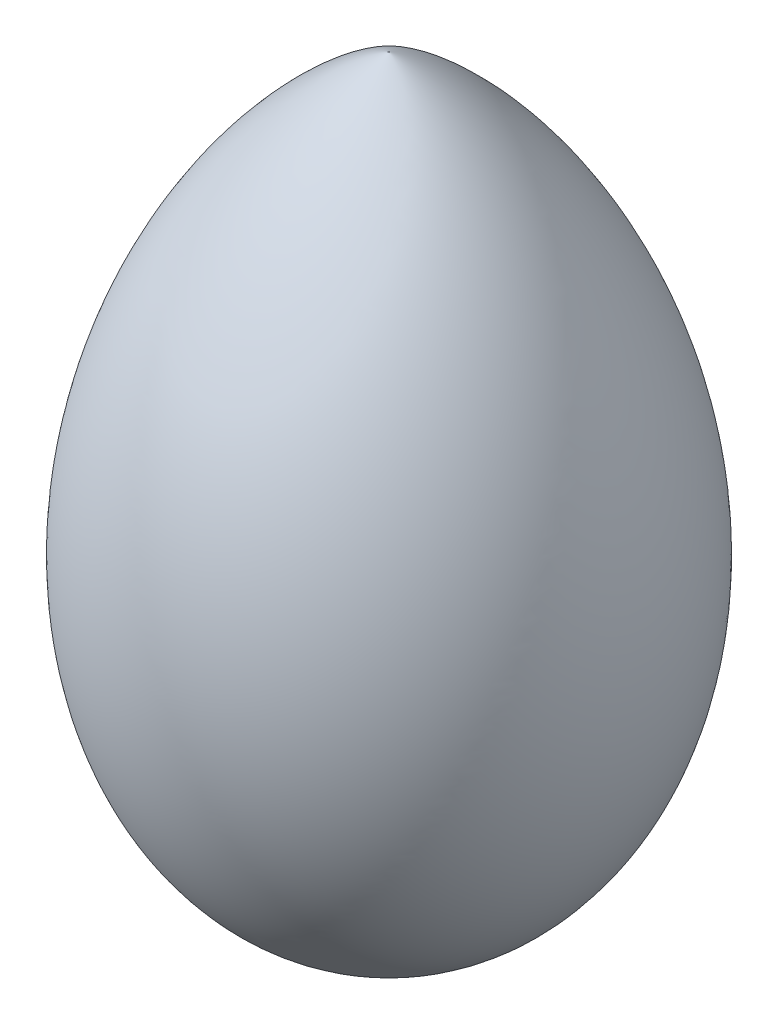
ISO-10303-21;
HEADER;
FILE_DESCRIPTION(('STEP AP214'),'2;1');
FILE_NAME('part.step','',(''),(''),'','','');
FILE_SCHEMA(('AUTOMOTIVE_DESIGN { 1 0 10303 214 1 1 1 1 }'));
ENDSEC;
DATA;
#1=APPLICATION_CONTEXT('core data for automotive mechanical design processes');
#2=APPLICATION_PROTOCOL_DEFINITION('international standard','automotive_design',2000,#1);
#3=PRODUCT_CONTEXT('',#1,'mechanical');
#4=PRODUCT('Part','Part','',(#3));
#5=PRODUCT_RELATED_PRODUCT_CATEGORY('part','',(#4));
#6=PRODUCT_DEFINITION_FORMATION('','',#4);
#7=PRODUCT_DEFINITION_CONTEXT('part definition',#1,'design');
#8=PRODUCT_DEFINITION('design','',#6,#7);
#9=PRODUCT_DEFINITION_SHAPE('','',#8);
#10=(LENGTH_UNIT() NAMED_UNIT(*) SI_UNIT(.MILLI.,.METRE.));
#11=(NAMED_UNIT(*) PLANE_ANGLE_UNIT() SI_UNIT($,.RADIAN.));
#12=(NAMED_UNIT(*) SI_UNIT($,.STERADIAN.) SOLID_ANGLE_UNIT());
#13=UNCERTAINTY_MEASURE_WITH_UNIT(LENGTH_MEASURE(1.E-05),#10,'distance_accuracy_value','');
#14=(GEOMETRIC_REPRESENTATION_CONTEXT(3) GLOBAL_UNCERTAINTY_ASSIGNED_CONTEXT((#13)) GLOBAL_UNIT_ASSIGNED_CONTEXT((#10,
#11,#12)) REPRESENTATION_CONTEXT('',''));
#15=CARTESIAN_POINT('',(0.,0.,0.));
#16=DIRECTION('',(0.,0.,1.));
#17=DIRECTION('',(1.,0.,0.));
#18=AXIS2_PLACEMENT_3D('',#15,#16,#17);
#19=CARTESIAN_POINT('',(-1.0398853970985E-11,-79.5774715459477,0.));
#20=CARTESIAN_POINT('',(0.0876805923341404,-79.5774715459478,0.));
#21=CARTESIAN_POINT('',(0.263797972575064,-79.5762299115467,0.));
#22=CARTESIAN_POINT('',(0.598650590856886,-79.5706425508887,0.));
#23=CARTESIAN_POINT('',(0.950876652571486,-79.5557486563722,0.));
#24=CARTESIAN_POINT('',(1.35262547212403,-79.5334221241474,0.));
#25=CARTESIAN_POINT('',(1.72703176838669,-79.5036800391544,0.));
#26=CARTESIAN_POINT('',(2.11530944355549,-79.4665451551406,0.));
#27=CARTESIAN_POINT('',(2.49518978074726,-79.4220456154996,0.));
#28=CARTESIAN_POINT('',(2.97332683239408,-79.357257557479,0.));
#29=CARTESIAN_POINT('',(3.54269888813024,-79.264927606383,0.));
#30=CARTESIAN_POINT('',(4.20460476573237,-79.1361341339061,0.));
#31=CARTESIAN_POINT('',(4.95420601058507,-78.9604694530783,0.));
#32=CARTESIAN_POINT('',(5.88274142070473,-78.7059305412052,0.));
#33=CARTESIAN_POINT('',(6.98062102196149,-78.3456897199416,0.));
#34=CARTESIAN_POINT('',(8.05511024966161,-77.9193233853256,0.));
#35=CARTESIAN_POINT('',(9.10205208383472,-77.4304669791197,0.));
#36=CARTESIAN_POINT('',(9.95460225664503,-76.9834055975815,0.));
#37=CARTESIAN_POINT('',(10.6240501917869,-76.6027582295668,0.));
#38=CARTESIAN_POINT('',(11.4444934505436,-76.0992379641618,0.));
#39=CARTESIAN_POINT('',(12.4018408014167,-75.4523461029347,0.));
#40=CARTESIAN_POINT('',(13.477279244194,-74.6390919759678,0.));
#41=CARTESIAN_POINT('',(14.6469295160346,-73.6360306984476,0.));
#42=CARTESIAN_POINT('',(16.0324846638131,-72.2982632564667,0.));
#43=CARTESIAN_POINT('',(17.5703966008741,-70.5710496856625,0.));
#44=CARTESIAN_POINT('',(19.0328275386001,-68.6021378476665,0.));
#45=CARTESIAN_POINT('',(20.3892255649037,-66.3962176969675,0.));
#46=CARTESIAN_POINT('',(21.5824370302139,-64.0991845678398,0.));
#47=CARTESIAN_POINT('',(22.4618657728492,-62.078453783561,0.));
#48=CARTESIAN_POINT('',(23.1713994969415,-60.1395719774442,0.));
#49=CARTESIAN_POINT('',(24.0780617054906,-57.195387525395,0.));
#50=CARTESIAN_POINT('',(24.931218987006,-53.4348933087704,0.));
#51=CARTESIAN_POINT('',(25.5220972050229,-48.4503546408996,0.));
#52=CARTESIAN_POINT('',(25.4671494748604,-42.275747962825,0.));
#53=CARTESIAN_POINT('',(24.6891735038918,-36.1519800546308,0.));
#54=CARTESIAN_POINT('',(23.237769759558,-30.1532766900786,0.));
#55=CARTESIAN_POINT('',(21.1535663445063,-24.3446370051788,0.));
#56=CARTESIAN_POINT('',(18.468657066632,-18.7882038275258,0.));
#57=CARTESIAN_POINT('',(15.2067873874591,-13.5488188649898,0.));
#58=CARTESIAN_POINT('',(11.8635522330858,-9.31351533749863,0.));
#59=CARTESIAN_POINT('',(8.65194495273465,-5.99775760871078,0.));
#60=CARTESIAN_POINT('',(6.02821040277064,-3.74744605475118,0.));
#61=CARTESIAN_POINT('',(4.18687293272993,-2.36896894898637,0.));
#62=CARTESIAN_POINT('',(2.79098993640259,-1.4557689738408,0.));
#63=CARTESIAN_POINT('',(1.89911185390225,-0.927774967500933,0.));
#64=CARTESIAN_POINT('',(1.20891495810726,-0.555188094697185,0.));
#65=CARTESIAN_POINT('',(0.792765610770951,-0.345754338027514,0.));
#66=CARTESIAN_POINT('',(0.430888145668768,-0.176914065924159,0.));
#67=CARTESIAN_POINT('',(0.186212553313267,-0.0719592793469132,0.));
#68=CARTESIAN_POINT('',(0.0623290833588892,-0.023341488057453,0.));
#69=CARTESIAN_POINT('',(-6.9406626701159E-12,0.,0.));
#70=B_SPLINE_CURVE_WITH_KNOTS('',4,(#19,#20,#21,#22,#23,#24,#25,#26,#27,#28,#29,#30,#31,#32,#33,
#34,#35,#36,#37,#38,#39,#40,#41,#42,#43,#44,#45,#46,#47,#48,#49,#50,#51,#52,#53,#54,#55,#56,#57,
#58,#59,#60,#61,#62,#63,#64,#65,#66,#67,#68,#69),.UNSPECIFIED.,.F.,.F.,(5,1,1,1,1,1,1,1,1,1,1,1,
1,1,1,1,1,1,1,1,1,1,1,1,1,1,1,1,1,1,1,1,1,1,1,1,1,1,1,1,1,1,1,1,1,1,1,5),(0.0889842727979694,
0.0924312928800519,0.0958783129621343,0.0993253330442168,0.102772353126299,0.106219373208382,
0.109666393290464,0.113113413372547,0.116560433454629,0.123454483320074,0.130348533185519,
0.137242583050964,0.144136632916409,0.157924696562186,0.171712760207964,0.178606822642936,
0.185500885077909,0.192394947512881,0.199289009947854,0.213077084610209,0.226865159272564,
0.240653288577068,0.254441417881571,0.282017661504337,0.309593764096882,0.32834201604834,
0.347090267999798,0.374666472698493,0.388454575047841,0.402242677397188,0.457395073933465,
0.512547464731353,0.567699899774951,0.622852335697732,0.678004748424371,0.733157135249234,
0.788309674961777,0.84346197685155,0.898614443046644,0.925986448179912,0.953358453313181,
0.967146068268635,0.980933683224089,0.985700262418067,0.990466841612045,0.995233420806022,
0.997616710403011,1.),.UNSPECIFIED.);
#71=CARTESIAN_POINT('',(-6.9309172405346E-12,-79.5774715459477,0.));
#72=DIRECTION('',(0.,-1.,0.));
#73=AXIS1_PLACEMENT('',#71,#72);
#74=SURFACE_OF_REVOLUTION('',#70,#73);
#75=CARTESIAN_POINT('',(-6.9309172405346E-12,0.,0.));
#76=VERTEX_POINT('',#75);
#77=VERTEX_LOOP('',#76);
#78=FACE_BOUND('',#77,.T.);
#79=CARTESIAN_POINT('',(-6.9309172405346E-12,-79.5774715459477,0.));
#80=VERTEX_POINT('',#79);
#81=VERTEX_LOOP('',#80);
#82=FACE_BOUND('',#81,.T.);
#83=ADVANCED_FACE('F40',(#78,#82),#74,.F.);
#84=CLOSED_SHELL('',(#83));
#85=MANIFOLD_SOLID_BREP('B2',#84);
#86=ADVANCED_BREP_SHAPE_REPRESENTATION('',(#18,#85),#14);
#87=SHAPE_DEFINITION_REPRESENTATION(#9,#86);
ENDSEC;
END-ISO-10303-21;
